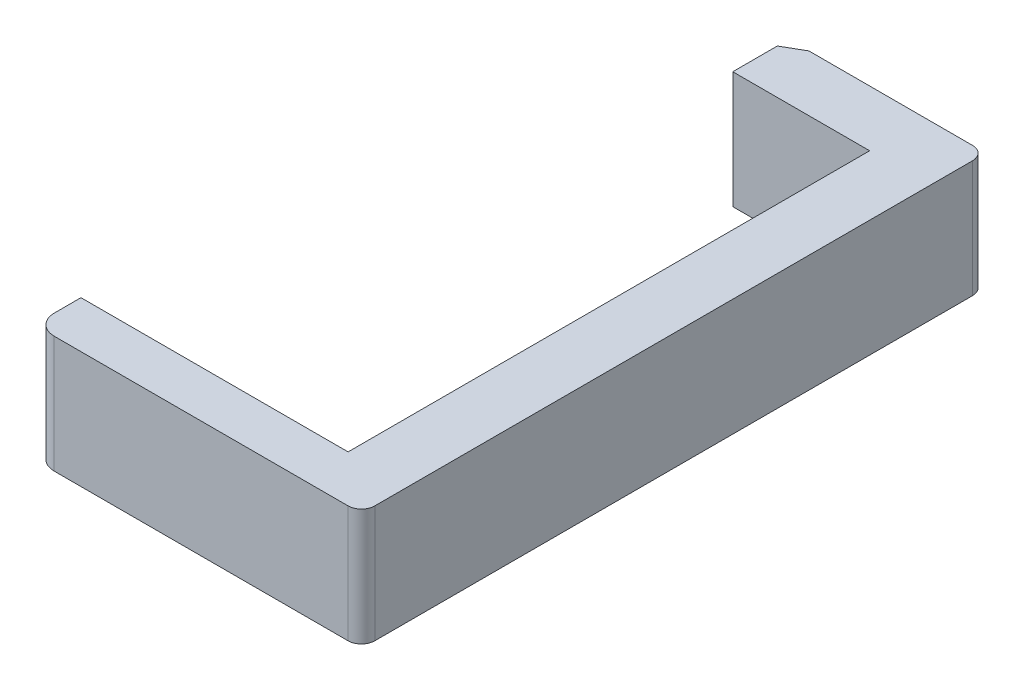
ISO-10303-21;
HEADER;
FILE_DESCRIPTION(('STEP AP214'),'2;1');
FILE_NAME('part.step','',(''),(''),'','','');
FILE_SCHEMA(('AUTOMOTIVE_DESIGN { 1 0 10303 214 1 1 1 1 }'));
ENDSEC;
DATA;
#1=APPLICATION_CONTEXT('core data for automotive mechanical design processes');
#2=APPLICATION_PROTOCOL_DEFINITION('international standard','automotive_design',2000,#1);
#3=PRODUCT_CONTEXT('',#1,'mechanical');
#4=PRODUCT('Part','Part','',(#3));
#5=PRODUCT_RELATED_PRODUCT_CATEGORY('part','',(#4));
#6=PRODUCT_DEFINITION_FORMATION('','',#4);
#7=PRODUCT_DEFINITION_CONTEXT('part definition',#1,'design');
#8=PRODUCT_DEFINITION('design','',#6,#7);
#9=PRODUCT_DEFINITION_SHAPE('','',#8);
#10=(LENGTH_UNIT() NAMED_UNIT(*) SI_UNIT(.MILLI.,.METRE.));
#11=(NAMED_UNIT(*) PLANE_ANGLE_UNIT() SI_UNIT($,.RADIAN.));
#12=(NAMED_UNIT(*) SI_UNIT($,.STERADIAN.) SOLID_ANGLE_UNIT());
#13=UNCERTAINTY_MEASURE_WITH_UNIT(LENGTH_MEASURE(1.E-05),#10,'distance_accuracy_value','');
#14=(GEOMETRIC_REPRESENTATION_CONTEXT(3) GLOBAL_UNCERTAINTY_ASSIGNED_CONTEXT((#13)) GLOBAL_UNIT_ASSIGNED_CONTEXT((#10,
#11,#12)) REPRESENTATION_CONTEXT('',''));
#15=CARTESIAN_POINT('',(0.,0.,0.));
#16=DIRECTION('',(0.,0.,1.));
#17=DIRECTION('',(1.,0.,0.));
#18=AXIS2_PLACEMENT_3D('',#15,#16,#17);
#19=CARTESIAN_POINT('',(0.,8.75,-39.05));
#20=DIRECTION('',(0.,0.,-1.));
#21=DIRECTION('',(-1.,0.,0.));
#22=AXIS2_PLACEMENT_3D('',#19,#20,#21);
#23=PLANE('',#22);
#24=DIRECTION('',(1.,0.,0.));
#25=VECTOR('',#24,1.);
#26=CARTESIAN_POINT('',(0.,-8.75,-39.05));
#27=LINE('',#26,#25);
#28=CARTESIAN_POINT('',(-20.5,-8.75,-39.05));
#29=VERTEX_POINT('',#28);
#30=CARTESIAN_POINT('',(0.,-8.75,-39.05));
#31=VERTEX_POINT('',#30);
#32=EDGE_CURVE('E162',#29,#31,#27,.T.);
#33=ORIENTED_EDGE('',*,*,#32,.T.);
#34=DIRECTION('',(0.,-1.,0.));
#35=VECTOR('',#34,1.);
#36=CARTESIAN_POINT('',(0.,8.75,-39.05));
#37=LINE('',#36,#35);
#38=CARTESIAN_POINT('',(0.,8.75,-39.05));
#39=VERTEX_POINT('',#38);
#40=EDGE_CURVE('E141',#39,#31,#37,.T.);
#41=ORIENTED_EDGE('',*,*,#40,.F.);
#42=DIRECTION('',(1.,0.,0.));
#43=VECTOR('',#42,1.);
#44=CARTESIAN_POINT('',(0.,8.75,-39.05));
#45=LINE('',#44,#43);
#46=CARTESIAN_POINT('',(-20.5,8.75,-39.05));
#47=VERTEX_POINT('',#46);
#48=EDGE_CURVE('E149',#47,#39,#45,.T.);
#49=ORIENTED_EDGE('',*,*,#48,.F.);
#50=DIRECTION('',(0.,-1.,0.));
#51=VECTOR('',#50,1.);
#52=CARTESIAN_POINT('',(-20.5,8.75,-39.05));
#53=LINE('',#52,#51);
#54=EDGE_CURVE('E246',#47,#29,#53,.T.);
#55=ORIENTED_EDGE('',*,*,#54,.T.);
#56=EDGE_LOOP('',(#33,#41,#49,#55));
#57=FACE_BOUND('',#56,.T.);
#58=ADVANCED_FACE('F47',(#57),#23,.F.);
#59=CARTESIAN_POINT('',(0.,8.75,-39.05));
#60=DIRECTION('',(1.,0.,0.));
#61=DIRECTION('',(0.,0.,-1.));
#62=AXIS2_PLACEMENT_3D('',#59,#60,#61);
#63=PLANE('',#62);
#64=DIRECTION('',(0.,0.,1.));
#65=VECTOR('',#64,1.);
#66=CARTESIAN_POINT('',(0.,-8.75,-39.05));
#67=LINE('',#66,#65);
#68=CARTESIAN_POINT('',(0.,-8.75,39.05));
#69=VERTEX_POINT('',#68);
#70=EDGE_CURVE('E255',#31,#69,#67,.T.);
#71=ORIENTED_EDGE('',*,*,#70,.T.);
#72=DIRECTION('',(0.,-1.,0.));
#73=VECTOR('',#72,1.);
#74=CARTESIAN_POINT('',(0.,8.75,39.05));
#75=LINE('',#74,#73);
#76=CARTESIAN_POINT('',(0.,8.75,39.05));
#77=VERTEX_POINT('',#76);
#78=EDGE_CURVE('E144',#77,#69,#75,.T.);
#79=ORIENTED_EDGE('',*,*,#78,.F.);
#80=DIRECTION('',(0.,0.,1.));
#81=VECTOR('',#80,1.);
#82=CARTESIAN_POINT('',(0.,8.75,-39.05));
#83=LINE('',#82,#81);
#84=EDGE_CURVE('E137',#39,#77,#83,.T.);
#85=ORIENTED_EDGE('',*,*,#84,.F.);
#86=ORIENTED_EDGE('',*,*,#40,.T.);
#87=EDGE_LOOP('',(#71,#79,#85,#86));
#88=FACE_BOUND('',#87,.T.);
#89=ADVANCED_FACE('F139',(#88),#63,.F.);
#90=CARTESIAN_POINT('',(-40.,8.75,39.05));
#91=DIRECTION('',(0.,0.,1.));
#92=DIRECTION('',(1.,0.,0.));
#93=AXIS2_PLACEMENT_3D('',#90,#91,#92);
#94=PLANE('',#93);
#95=DIRECTION('',(-1.,0.,0.));
#96=VECTOR('',#95,1.);
#97=CARTESIAN_POINT('',(-40.,-8.75,39.05));
#98=LINE('',#97,#96);
#99=CARTESIAN_POINT('',(-40.,-8.75,39.05));
#100=VERTEX_POINT('',#99);
#101=EDGE_CURVE('E237',#69,#100,#98,.T.);
#102=ORIENTED_EDGE('',*,*,#101,.T.);
#103=DIRECTION('',(0.,-1.,0.));
#104=VECTOR('',#103,1.);
#105=CARTESIAN_POINT('',(-40.,8.75,39.05));
#106=LINE('',#105,#104);
#107=CARTESIAN_POINT('',(-40.,8.75,39.05));
#108=VERTEX_POINT('',#107);
#109=EDGE_CURVE('E170',#108,#100,#106,.T.);
#110=ORIENTED_EDGE('',*,*,#109,.F.);
#111=DIRECTION('',(-1.,0.,0.));
#112=VECTOR('',#111,1.);
#113=CARTESIAN_POINT('',(-40.,8.75,39.05));
#114=LINE('',#113,#112);
#115=EDGE_CURVE('E148',#77,#108,#114,.T.);
#116=ORIENTED_EDGE('',*,*,#115,.F.);
#117=ORIENTED_EDGE('',*,*,#78,.T.);
#118=EDGE_LOOP('',(#102,#110,#116,#117));
#119=FACE_BOUND('',#118,.T.);
#120=ADVANCED_FACE('F277',(#119),#94,.F.);
#121=CARTESIAN_POINT('',(-40.,8.75,46.05));
#122=DIRECTION('',(1.,0.,0.));
#123=DIRECTION('',(0.,0.,-1.));
#124=AXIS2_PLACEMENT_3D('',#121,#122,#123);
#125=PLANE('',#124);
#126=DIRECTION('',(0.,0.,1.));
#127=VECTOR('',#126,1.);
#128=CARTESIAN_POINT('',(-40.,-8.75,46.05));
#129=LINE('',#128,#127);
#130=CARTESIAN_POINT('',(-40.,-8.75,43.05));
#131=VERTEX_POINT('',#130);
#132=EDGE_CURVE('E230',#100,#131,#129,.T.);
#133=ORIENTED_EDGE('',*,*,#132,.T.);
#134=DIRECTION('',(0.,-1.,0.));
#135=VECTOR('',#134,1.);
#136=CARTESIAN_POINT('',(-40.,8.75,43.05));
#137=LINE('',#136,#135);
#138=CARTESIAN_POINT('',(-40.,8.75,43.05));
#139=VERTEX_POINT('',#138);
#140=EDGE_CURVE('E56',#131,#139,#137,.F.);
#141=ORIENTED_EDGE('',*,*,#140,.T.);
#142=DIRECTION('',(0.,0.,1.));
#143=VECTOR('',#142,1.);
#144=CARTESIAN_POINT('',(-40.,8.75,46.05));
#145=LINE('',#144,#143);
#146=EDGE_CURVE('E252',#108,#139,#145,.T.);
#147=ORIENTED_EDGE('',*,*,#146,.F.);
#148=ORIENTED_EDGE('',*,*,#109,.T.);
#149=EDGE_LOOP('',(#133,#141,#147,#148));
#150=FACE_BOUND('',#149,.T.);
#151=ADVANCED_FACE('F251',(#150),#125,.F.);
#152=CARTESIAN_POINT('',(9.00000000000001,8.75,46.05));
#153=DIRECTION('',(0.,0.,-1.));
#154=DIRECTION('',(-1.,0.,0.));
#155=AXIS2_PLACEMENT_3D('',#152,#153,#154);
#156=PLANE('',#155);
#157=DIRECTION('',(1.,0.,0.));
#158=VECTOR('',#157,1.);
#159=CARTESIAN_POINT('',(9.00000000000001,8.75,46.05));
#160=LINE('',#159,#158);
#161=CARTESIAN_POINT('',(-37.,8.75,46.05));
#162=VERTEX_POINT('',#161);
#163=CARTESIAN_POINT('',(7.00000000000001,8.75,46.05));
#164=VERTEX_POINT('',#163);
#165=EDGE_CURVE('E222',#162,#164,#160,.T.);
#166=ORIENTED_EDGE('',*,*,#165,.F.);
#167=DIRECTION('',(0.,-1.,0.));
#168=VECTOR('',#167,1.);
#169=CARTESIAN_POINT('',(-37.,8.75,46.05));
#170=LINE('',#169,#168);
#171=CARTESIAN_POINT('',(-37.,-8.75,46.05));
#172=VERTEX_POINT('',#171);
#173=EDGE_CURVE('E211',#162,#172,#170,.T.);
#174=ORIENTED_EDGE('',*,*,#173,.T.);
#175=DIRECTION('',(1.,0.,0.));
#176=VECTOR('',#175,1.);
#177=CARTESIAN_POINT('',(9.00000000000001,-8.75,46.05));
#178=LINE('',#177,#176);
#179=CARTESIAN_POINT('',(7.00000000000001,-8.75,46.05));
#180=VERTEX_POINT('',#179);
#181=EDGE_CURVE('E221',#172,#180,#178,.T.);
#182=ORIENTED_EDGE('',*,*,#181,.T.);
#183=DIRECTION('',(0.,-1.,0.));
#184=VECTOR('',#183,1.);
#185=CARTESIAN_POINT('',(7.00000000000001,8.75,46.05));
#186=LINE('',#185,#184);
#187=EDGE_CURVE('E184',#180,#164,#186,.F.);
#188=ORIENTED_EDGE('',*,*,#187,.T.);
#189=EDGE_LOOP('',(#166,#174,#182,#188));
#190=FACE_BOUND('',#189,.T.);
#191=ADVANCED_FACE('F220',(#190),#156,.F.);
#192=CARTESIAN_POINT('',(9.,8.75,-47.45));
#193=DIRECTION('',(-1.,0.,0.));
#194=DIRECTION('',(0.,0.,1.));
#195=AXIS2_PLACEMENT_3D('',#192,#193,#194);
#196=PLANE('',#195);
#197=DIRECTION('',(0.,0.,-1.));
#198=VECTOR('',#197,1.);
#199=CARTESIAN_POINT('',(9.,8.75,-47.45));
#200=LINE('',#199,#198);
#201=CARTESIAN_POINT('',(9.00000000000001,8.75,44.05));
#202=VERTEX_POINT('',#201);
#203=CARTESIAN_POINT('',(9.,8.75,-45.45));
#204=VERTEX_POINT('',#203);
#205=EDGE_CURVE('E268',#202,#204,#200,.T.);
#206=ORIENTED_EDGE('',*,*,#205,.F.);
#207=DIRECTION('',(0.,-1.,0.));
#208=VECTOR('',#207,1.);
#209=CARTESIAN_POINT('',(9.00000000000001,8.75,44.05));
#210=LINE('',#209,#208);
#211=CARTESIAN_POINT('',(9.00000000000001,-8.75,44.05));
#212=VERTEX_POINT('',#211);
#213=EDGE_CURVE('E168',#202,#212,#210,.T.);
#214=ORIENTED_EDGE('',*,*,#213,.T.);
#215=DIRECTION('',(0.,0.,-1.));
#216=VECTOR('',#215,1.);
#217=CARTESIAN_POINT('',(9.,-8.75,-47.45));
#218=LINE('',#217,#216);
#219=CARTESIAN_POINT('',(9.,-8.75,-45.45));
#220=VERTEX_POINT('',#219);
#221=EDGE_CURVE('E229',#212,#220,#218,.T.);
#222=ORIENTED_EDGE('',*,*,#221,.T.);
#223=DIRECTION('',(0.,-1.,0.));
#224=VECTOR('',#223,1.);
#225=CARTESIAN_POINT('',(9.,8.75,-45.45));
#226=LINE('',#225,#224);
#227=EDGE_CURVE('E164',#220,#204,#226,.F.);
#228=ORIENTED_EDGE('',*,*,#227,.T.);
#229=EDGE_LOOP('',(#206,#214,#222,#228));
#230=FACE_BOUND('',#229,.T.);
#231=ADVANCED_FACE('F324',(#230),#196,.F.);
#232=CARTESIAN_POINT('',(-20.5,8.75,-47.45));
#233=DIRECTION('',(0.,0.,1.));
#234=DIRECTION('',(1.,0.,0.));
#235=AXIS2_PLACEMENT_3D('',#232,#233,#234);
#236=PLANE('',#235);
#237=DIRECTION('',(-1.,0.,0.));
#238=VECTOR('',#237,1.);
#239=CARTESIAN_POINT('',(-20.5,-8.75,-47.45));
#240=LINE('',#239,#238);
#241=CARTESIAN_POINT('',(7.,-8.75,-47.45));
#242=VERTEX_POINT('',#241);
#243=CARTESIAN_POINT('',(-17.5,-8.75,-47.45));
#244=VERTEX_POINT('',#243);
#245=EDGE_CURVE('E235',#242,#244,#240,.T.);
#246=ORIENTED_EDGE('',*,*,#245,.T.);
#247=DIRECTION('',(0.,1.,0.));
#248=VECTOR('',#247,1.);
#249=CARTESIAN_POINT('',(-17.5,8.75,-47.45));
#250=LINE('',#249,#248);
#251=CARTESIAN_POINT('',(-17.5,8.75,-47.45));
#252=VERTEX_POINT('',#251);
#253=EDGE_CURVE('E205',#244,#252,#250,.T.);
#254=ORIENTED_EDGE('',*,*,#253,.T.);
#255=DIRECTION('',(-1.,0.,0.));
#256=VECTOR('',#255,1.);
#257=CARTESIAN_POINT('',(-20.5,8.75,-47.45));
#258=LINE('',#257,#256);
#259=CARTESIAN_POINT('',(7.,8.75,-47.45));
#260=VERTEX_POINT('',#259);
#261=EDGE_CURVE('E264',#260,#252,#258,.T.);
#262=ORIENTED_EDGE('',*,*,#261,.F.);
#263=DIRECTION('',(0.,-1.,0.));
#264=VECTOR('',#263,1.);
#265=CARTESIAN_POINT('',(7.,8.75,-47.45));
#266=LINE('',#265,#264);
#267=EDGE_CURVE('E194',#260,#242,#266,.T.);
#268=ORIENTED_EDGE('',*,*,#267,.T.);
#269=EDGE_LOOP('',(#246,#254,#262,#268));
#270=FACE_BOUND('',#269,.T.);
#271=ADVANCED_FACE('F318',(#270),#236,.F.);
#272=CARTESIAN_POINT('',(-20.5,8.75,-39.05));
#273=DIRECTION('',(1.,0.,0.));
#274=DIRECTION('',(0.,0.,-1.));
#275=AXIS2_PLACEMENT_3D('',#272,#273,#274);
#276=PLANE('',#275);
#277=DIRECTION('',(0.,0.,1.));
#278=VECTOR('',#277,1.);
#279=CARTESIAN_POINT('',(-20.5,8.75,-39.05));
#280=LINE('',#279,#278);
#281=CARTESIAN_POINT('',(-20.5,8.75,-45.7179491924311));
#282=VERTEX_POINT('',#281);
#283=EDGE_CURVE('E154',#282,#47,#280,.T.);
#284=ORIENTED_EDGE('',*,*,#283,.F.);
#285=DIRECTION('',(0.,-1.,0.));
#286=VECTOR('',#285,1.);
#287=CARTESIAN_POINT('',(-20.5,8.75,-45.7179491924311));
#288=LINE('',#287,#286);
#289=CARTESIAN_POINT('',(-20.5,-8.75,-45.7179491924311));
#290=VERTEX_POINT('',#289);
#291=EDGE_CURVE('E198',#282,#290,#288,.T.);
#292=ORIENTED_EDGE('',*,*,#291,.T.);
#293=DIRECTION('',(0.,0.,1.));
#294=VECTOR('',#293,1.);
#295=CARTESIAN_POINT('',(-20.5,-8.75,-39.05));
#296=LINE('',#295,#294);
#297=EDGE_CURVE('E159',#290,#29,#296,.T.);
#298=ORIENTED_EDGE('',*,*,#297,.T.);
#299=ORIENTED_EDGE('',*,*,#54,.F.);
#300=EDGE_LOOP('',(#284,#292,#298,#299));
#301=FACE_BOUND('',#300,.T.);
#302=ADVANCED_FACE('F314',(#301),#276,.F.);
#303=CARTESIAN_POINT('',(0.,8.75,0.));
#304=DIRECTION('',(0.,-1.,0.));
#305=DIRECTION('',(0.,0.,-1.));
#306=AXIS2_PLACEMENT_3D('',#303,#304,#305);
#307=PLANE('',#306);
#308=ORIENTED_EDGE('',*,*,#146,.T.);
#309=CARTESIAN_POINT('',(-37.,8.75,43.05));
#310=DIRECTION('',(0.,-1.,0.));
#311=DIRECTION('',(0.,0.,-1.));
#312=AXIS2_PLACEMENT_3D('',#309,#310,#311);
#313=CIRCLE('',#312,3.);
#314=EDGE_CURVE('E11',#139,#162,#313,.F.);
#315=ORIENTED_EDGE('',*,*,#314,.T.);
#316=ORIENTED_EDGE('',*,*,#165,.T.);
#317=CARTESIAN_POINT('',(7.00000000000001,8.75,44.05));
#318=DIRECTION('',(0.,-1.,0.));
#319=DIRECTION('',(0.,0.,-1.));
#320=AXIS2_PLACEMENT_3D('',#317,#318,#319);
#321=CIRCLE('',#320,2.);
#322=EDGE_CURVE('E191',#164,#202,#321,.F.);
#323=ORIENTED_EDGE('',*,*,#322,.T.);
#324=ORIENTED_EDGE('',*,*,#205,.T.);
#325=CARTESIAN_POINT('',(7.,8.75,-45.45));
#326=DIRECTION('',(0.,-1.,0.));
#327=DIRECTION('',(0.,0.,-1.));
#328=AXIS2_PLACEMENT_3D('',#325,#326,#327);
#329=CIRCLE('',#328,2.);
#330=EDGE_CURVE('E188',#204,#260,#329,.F.);
#331=ORIENTED_EDGE('',*,*,#330,.T.);
#332=ORIENTED_EDGE('',*,*,#261,.T.);
#333=DIRECTION('',(0.866025403784441,0.,-0.499999999999997));
#334=VECTOR('',#333,1.);
#335=CARTESIAN_POINT('',(-20.5,8.75,-45.7179491924311));
#336=LINE('',#335,#334);
#337=EDGE_CURVE('E208',#252,#282,#336,.F.);
#338=ORIENTED_EDGE('',*,*,#337,.T.);
#339=ORIENTED_EDGE('',*,*,#283,.T.);
#340=ORIENTED_EDGE('',*,*,#48,.T.);
#341=ORIENTED_EDGE('',*,*,#84,.T.);
#342=ORIENTED_EDGE('',*,*,#115,.T.);
#343=EDGE_LOOP('',(#308,#315,#316,#323,#324,#331,#332,#338,#339,#340,#341,#342));
#344=FACE_BOUND('',#343,.T.);
#345=ADVANCED_FACE('F152',(#344),#307,.F.);
#346=CARTESIAN_POINT('',(0.,-8.75,0.));
#347=DIRECTION('',(0.,-1.,0.));
#348=DIRECTION('',(0.,0.,-1.));
#349=AXIS2_PLACEMENT_3D('',#346,#347,#348);
#350=PLANE('',#349);
#351=ORIENTED_EDGE('',*,*,#181,.F.);
#352=CARTESIAN_POINT('',(-37.,-8.75,43.05));
#353=DIRECTION('',(0.,-1.,0.));
#354=DIRECTION('',(0.,0.,-1.));
#355=AXIS2_PLACEMENT_3D('',#352,#353,#354);
#356=CIRCLE('',#355,3.);
#357=EDGE_CURVE('E70',#172,#131,#356,.T.);
#358=ORIENTED_EDGE('',*,*,#357,.T.);
#359=ORIENTED_EDGE('',*,*,#132,.F.);
#360=ORIENTED_EDGE('',*,*,#101,.F.);
#361=ORIENTED_EDGE('',*,*,#70,.F.);
#362=ORIENTED_EDGE('',*,*,#32,.F.);
#363=ORIENTED_EDGE('',*,*,#297,.F.);
#364=DIRECTION('',(-0.866025403784441,0.,0.499999999999997));
#365=VECTOR('',#364,1.);
#366=CARTESIAN_POINT('',(-24.9214527047856,-8.75,-43.165222283114));
#367=LINE('',#366,#365);
#368=EDGE_CURVE('E202',#290,#244,#367,.F.);
#369=ORIENTED_EDGE('',*,*,#368,.T.);
#370=ORIENTED_EDGE('',*,*,#245,.F.);
#371=CARTESIAN_POINT('',(7.,-8.75,-45.45));
#372=DIRECTION('',(0.,-1.,0.));
#373=DIRECTION('',(0.,0.,-1.));
#374=AXIS2_PLACEMENT_3D('',#371,#372,#373);
#375=CIRCLE('',#374,2.);
#376=EDGE_CURVE('E177',#242,#220,#375,.T.);
#377=ORIENTED_EDGE('',*,*,#376,.T.);
#378=ORIENTED_EDGE('',*,*,#221,.F.);
#379=CARTESIAN_POINT('',(7.00000000000001,-8.75,44.05));
#380=DIRECTION('',(0.,-1.,0.));
#381=DIRECTION('',(0.,0.,-1.));
#382=AXIS2_PLACEMENT_3D('',#379,#380,#381);
#383=CIRCLE('',#382,2.);
#384=EDGE_CURVE('E180',#212,#180,#383,.T.);
#385=ORIENTED_EDGE('',*,*,#384,.T.);
#386=EDGE_LOOP('',(#351,#358,#359,#360,#361,#362,#363,#369,#370,#377,#378,#385));
#387=FACE_BOUND('',#386,.T.);
#388=ADVANCED_FACE('F225',(#387),#350,.T.);
#389=CARTESIAN_POINT('',(7.00000000000001,8.75,44.05));
#390=DIRECTION('',(0.,-1.,0.));
#391=DIRECTION('',(0.,0.,-1.));
#392=AXIS2_PLACEMENT_3D('',#389,#390,#391);
#393=CYLINDRICAL_SURFACE('',#392,2.);
#394=ORIENTED_EDGE('',*,*,#322,.F.);
#395=ORIENTED_EDGE('',*,*,#187,.F.);
#396=ORIENTED_EDGE('',*,*,#384,.F.);
#397=ORIENTED_EDGE('',*,*,#213,.F.);
#398=EDGE_LOOP('',(#394,#395,#396,#397));
#399=FACE_BOUND('',#398,.T.);
#400=ADVANCED_FACE('F292',(#399),#393,.T.);
#401=CARTESIAN_POINT('',(7.,8.75,-45.45));
#402=DIRECTION('',(0.,-1.,0.));
#403=DIRECTION('',(0.,0.,-1.));
#404=AXIS2_PLACEMENT_3D('',#401,#402,#403);
#405=CYLINDRICAL_SURFACE('',#404,2.);
#406=ORIENTED_EDGE('',*,*,#330,.F.);
#407=ORIENTED_EDGE('',*,*,#227,.F.);
#408=ORIENTED_EDGE('',*,*,#376,.F.);
#409=ORIENTED_EDGE('',*,*,#267,.F.);
#410=EDGE_LOOP('',(#406,#407,#408,#409));
#411=FACE_BOUND('',#410,.T.);
#412=ADVANCED_FACE('F295',(#411),#405,.T.);
#413=CARTESIAN_POINT('',(-20.5,8.75,-45.7179491924311));
#414=DIRECTION('',(0.499999999999997,0.,0.866025403784441));
#415=DIRECTION('',(0.,-1.,0.));
#416=AXIS2_PLACEMENT_3D('',#413,#414,#415);
#417=PLANE('',#416);
#418=ORIENTED_EDGE('',*,*,#337,.F.);
#419=ORIENTED_EDGE('',*,*,#253,.F.);
#420=ORIENTED_EDGE('',*,*,#368,.F.);
#421=ORIENTED_EDGE('',*,*,#291,.F.);
#422=EDGE_LOOP('',(#418,#419,#420,#421));
#423=FACE_BOUND('',#422,.T.);
#424=ADVANCED_FACE('F298',(#423),#417,.F.);
#425=CARTESIAN_POINT('',(-37.,8.75,43.05));
#426=DIRECTION('',(0.,-1.,0.));
#427=DIRECTION('',(0.,0.,-1.));
#428=AXIS2_PLACEMENT_3D('',#425,#426,#427);
#429=CYLINDRICAL_SURFACE('',#428,3.);
#430=ORIENTED_EDGE('',*,*,#314,.F.);
#431=ORIENTED_EDGE('',*,*,#140,.F.);
#432=ORIENTED_EDGE('',*,*,#357,.F.);
#433=ORIENTED_EDGE('',*,*,#173,.F.);
#434=EDGE_LOOP('',(#430,#431,#432,#433));
#435=FACE_BOUND('',#434,.T.);
#436=ADVANCED_FACE('F49',(#435),#429,.T.);
#437=CLOSED_SHELL('',(#58,#89,#120,#151,#191,#231,#271,#302,#345,#388,#400,#412,#424,#436));
#438=MANIFOLD_SOLID_BREP('B2',#437);
#439=ADVANCED_BREP_SHAPE_REPRESENTATION('',(#18,#438),#14);
#440=SHAPE_DEFINITION_REPRESENTATION(#9,#439);
ENDSEC;
END-ISO-10303-21;
